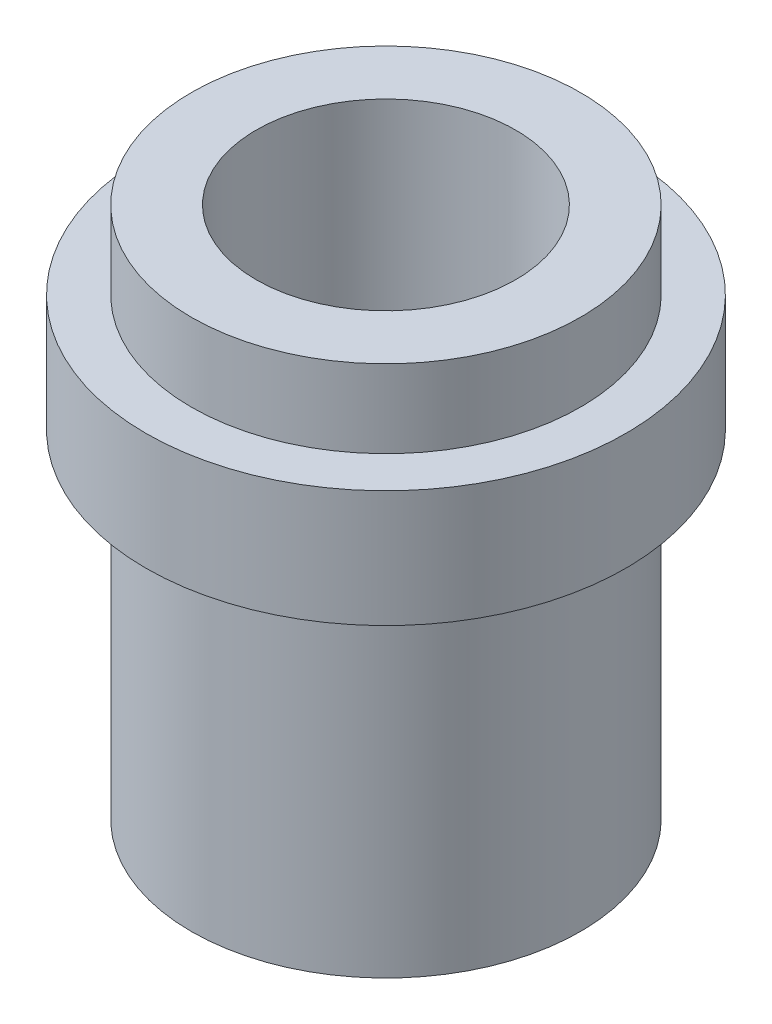
ISO-10303-21;
HEADER;
FILE_DESCRIPTION(('STEP AP214'),'2;1');
FILE_NAME('part.step','',(''),(''),'','','');
FILE_SCHEMA(('AUTOMOTIVE_DESIGN { 1 0 10303 214 1 1 1 1 }'));
ENDSEC;
DATA;
#1=APPLICATION_CONTEXT('core data for automotive mechanical design processes');
#2=APPLICATION_PROTOCOL_DEFINITION('international standard','automotive_design',2000,#1);
#3=PRODUCT_CONTEXT('',#1,'mechanical');
#4=PRODUCT('Part','Part','',(#3));
#5=PRODUCT_RELATED_PRODUCT_CATEGORY('part','',(#4));
#6=PRODUCT_DEFINITION_FORMATION('','',#4);
#7=PRODUCT_DEFINITION_CONTEXT('part definition',#1,'design');
#8=PRODUCT_DEFINITION('design','',#6,#7);
#9=PRODUCT_DEFINITION_SHAPE('','',#8);
#10=(LENGTH_UNIT() NAMED_UNIT(*) SI_UNIT(.MILLI.,.METRE.));
#11=(NAMED_UNIT(*) PLANE_ANGLE_UNIT() SI_UNIT($,.RADIAN.));
#12=(NAMED_UNIT(*) SI_UNIT($,.STERADIAN.) SOLID_ANGLE_UNIT());
#13=UNCERTAINTY_MEASURE_WITH_UNIT(LENGTH_MEASURE(1.E-05),#10,'distance_accuracy_value','');
#14=(GEOMETRIC_REPRESENTATION_CONTEXT(3) GLOBAL_UNCERTAINTY_ASSIGNED_CONTEXT((#13)) GLOBAL_UNIT_ASSIGNED_CONTEXT((#10,
#11,#12)) REPRESENTATION_CONTEXT('',''));
#15=CARTESIAN_POINT('',(0.,0.,0.));
#16=DIRECTION('',(0.,0.,1.));
#17=DIRECTION('',(1.,0.,0.));
#18=AXIS2_PLACEMENT_3D('',#15,#16,#17);
#19=CARTESIAN_POINT('',(0.,33.5814136887096,0.));
#20=DIRECTION('',(0.,-1.,0.));
#21=DIRECTION('',(0.,0.,-1.));
#22=AXIS2_PLACEMENT_3D('',#19,#20,#21);
#23=PLANE('',#22);
#24=CARTESIAN_POINT('',(0.,33.5814136887096,0.));
#25=DIRECTION('',(0.,1.,0.));
#26=DIRECTION('',(0.,0.,1.));
#27=AXIS2_PLACEMENT_3D('',#24,#25,#26);
#28=CIRCLE('',#27,10.);
#29=CARTESIAN_POINT('',(0.,33.5814136887096,10.));
#30=VERTEX_POINT('',#29);
#31=EDGE_CURVE('E56',#30,#30,#28,.T.);
#32=ORIENTED_EDGE('',*,*,#31,.F.);
#33=EDGE_LOOP('',(#32));
#34=FACE_BOUND('',#33,.T.);
#35=CARTESIAN_POINT('',(0.,33.5814136887096,0.));
#36=DIRECTION('',(0.,1.,0.));
#37=DIRECTION('',(0.,0.,1.));
#38=AXIS2_PLACEMENT_3D('',#35,#36,#37);
#39=CIRCLE('',#38,15.);
#40=CARTESIAN_POINT('',(0.,33.5814136887096,15.));
#41=VERTEX_POINT('',#40);
#42=EDGE_CURVE('E10',#41,#41,#39,.T.);
#43=ORIENTED_EDGE('',*,*,#42,.T.);
#44=EDGE_LOOP('',(#43));
#45=FACE_BOUND('',#44,.T.);
#46=ADVANCED_FACE('F31',(#34,#45),#23,.F.);
#47=CARTESIAN_POINT('',(0.,46.5033776301218,0.));
#48=DIRECTION('',(0.,1.,0.));
#49=DIRECTION('',(0.,0.,1.));
#50=AXIS2_PLACEMENT_3D('',#47,#48,#49);
#51=CYLINDRICAL_SURFACE('',#50,15.);
#52=ORIENTED_EDGE('',*,*,#42,.F.);
#53=EDGE_LOOP('',(#52));
#54=FACE_BOUND('',#53,.T.);
#55=CARTESIAN_POINT('',(0.,27.5814136887096,0.));
#56=DIRECTION('',(0.,1.,0.));
#57=DIRECTION('',(0.,0.,1.));
#58=AXIS2_PLACEMENT_3D('',#55,#56,#57);
#59=CIRCLE('',#58,15.);
#60=CARTESIAN_POINT('',(0.,27.5814136887096,15.));
#61=VERTEX_POINT('',#60);
#62=EDGE_CURVE('E38',#61,#61,#59,.T.);
#63=ORIENTED_EDGE('',*,*,#62,.T.);
#64=EDGE_LOOP('',(#63));
#65=FACE_BOUND('',#64,.T.);
#66=ADVANCED_FACE('F75',(#54,#65),#51,.T.);
#67=CARTESIAN_POINT('',(15.,27.5814136887096,0.));
#68=DIRECTION('',(0.,-1.,0.));
#69=DIRECTION('',(0.,0.,-1.));
#70=AXIS2_PLACEMENT_3D('',#67,#68,#69);
#71=PLANE('',#70);
#72=ORIENTED_EDGE('',*,*,#62,.F.);
#73=EDGE_LOOP('',(#72));
#74=FACE_BOUND('',#73,.T.);
#75=CARTESIAN_POINT('',(0.,27.5814136887096,0.));
#76=DIRECTION('',(0.,1.,0.));
#77=DIRECTION('',(0.,0.,1.));
#78=AXIS2_PLACEMENT_3D('',#75,#76,#77);
#79=CIRCLE('',#78,18.5);
#80=CARTESIAN_POINT('',(0.,27.5814136887096,18.5));
#81=VERTEX_POINT('',#80);
#82=EDGE_CURVE('E42',#81,#81,#79,.T.);
#83=ORIENTED_EDGE('',*,*,#82,.T.);
#84=EDGE_LOOP('',(#83));
#85=FACE_BOUND('',#84,.T.);
#86=ADVANCED_FACE('F80',(#74,#85),#71,.F.);
#87=CARTESIAN_POINT('',(0.,46.5033776301218,0.));
#88=DIRECTION('',(0.,1.,0.));
#89=DIRECTION('',(0.,0.,1.));
#90=AXIS2_PLACEMENT_3D('',#87,#88,#89);
#91=CYLINDRICAL_SURFACE('',#90,18.5);
#92=ORIENTED_EDGE('',*,*,#82,.F.);
#93=EDGE_LOOP('',(#92));
#94=FACE_BOUND('',#93,.T.);
#95=CARTESIAN_POINT('',(0.,18.5814136887096,0.));
#96=DIRECTION('',(0.,1.,0.));
#97=DIRECTION('',(0.,0.,1.));
#98=AXIS2_PLACEMENT_3D('',#95,#96,#97);
#99=CIRCLE('',#98,18.5);
#100=CARTESIAN_POINT('',(0.,18.5814136887096,18.5));
#101=VERTEX_POINT('',#100);
#102=EDGE_CURVE('E47',#101,#101,#99,.T.);
#103=ORIENTED_EDGE('',*,*,#102,.T.);
#104=EDGE_LOOP('',(#103));
#105=FACE_BOUND('',#104,.T.);
#106=ADVANCED_FACE('F85',(#94,#105),#91,.T.);
#107=CARTESIAN_POINT('',(18.5,18.5814136887096,0.));
#108=DIRECTION('',(0.,1.,0.));
#109=DIRECTION('',(0.,0.,1.));
#110=AXIS2_PLACEMENT_3D('',#107,#108,#109);
#111=PLANE('',#110);
#112=ORIENTED_EDGE('',*,*,#102,.F.);
#113=EDGE_LOOP('',(#112));
#114=FACE_BOUND('',#113,.T.);
#115=CARTESIAN_POINT('',(0.,18.5814136887096,0.));
#116=DIRECTION('',(0.,1.,0.));
#117=DIRECTION('',(0.,0.,1.));
#118=AXIS2_PLACEMENT_3D('',#115,#116,#117);
#119=CIRCLE('',#118,15.);
#120=CARTESIAN_POINT('',(0.,18.5814136887096,15.));
#121=VERTEX_POINT('',#120);
#122=EDGE_CURVE('E50',#121,#121,#119,.T.);
#123=ORIENTED_EDGE('',*,*,#122,.T.);
#124=EDGE_LOOP('',(#123));
#125=FACE_BOUND('',#124,.T.);
#126=ADVANCED_FACE('F92',(#114,#125),#111,.F.);
#127=CARTESIAN_POINT('',(0.,46.5033776301218,0.));
#128=DIRECTION('',(0.,1.,0.));
#129=DIRECTION('',(0.,0.,1.));
#130=AXIS2_PLACEMENT_3D('',#127,#128,#129);
#131=CYLINDRICAL_SURFACE('',#130,15.);
#132=ORIENTED_EDGE('',*,*,#122,.F.);
#133=EDGE_LOOP('',(#132));
#134=FACE_BOUND('',#133,.T.);
#135=CARTESIAN_POINT('',(0.,-7.41858631129039,0.));
#136=DIRECTION('',(0.,1.,0.));
#137=DIRECTION('',(0.,0.,1.));
#138=AXIS2_PLACEMENT_3D('',#135,#136,#137);
#139=CIRCLE('',#138,15.);
#140=CARTESIAN_POINT('',(0.,-7.41858631129039,15.));
#141=VERTEX_POINT('',#140);
#142=EDGE_CURVE('E53',#141,#141,#139,.T.);
#143=ORIENTED_EDGE('',*,*,#142,.T.);
#144=EDGE_LOOP('',(#143));
#145=FACE_BOUND('',#144,.T.);
#146=ADVANCED_FACE('F72',(#134,#145),#131,.T.);
#147=CARTESIAN_POINT('',(15.,-7.41858631129039,0.));
#148=DIRECTION('',(0.,1.,0.));
#149=DIRECTION('',(0.,0.,1.));
#150=AXIS2_PLACEMENT_3D('',#147,#148,#149);
#151=PLANE('',#150);
#152=CARTESIAN_POINT('',(0.,-7.41858631129039,0.));
#153=DIRECTION('',(0.,1.,0.));
#154=DIRECTION('',(0.,0.,1.));
#155=AXIS2_PLACEMENT_3D('',#152,#153,#154);
#156=CIRCLE('',#155,10.);
#157=CARTESIAN_POINT('',(0.,-7.41858631129039,10.));
#158=VERTEX_POINT('',#157);
#159=EDGE_CURVE('E34',#158,#158,#156,.T.);
#160=ORIENTED_EDGE('',*,*,#159,.T.);
#161=EDGE_LOOP('',(#160));
#162=FACE_BOUND('',#161,.T.);
#163=ORIENTED_EDGE('',*,*,#142,.F.);
#164=EDGE_LOOP('',(#163));
#165=FACE_BOUND('',#164,.T.);
#166=ADVANCED_FACE('F63',(#162,#165),#151,.F.);
#167=CARTESIAN_POINT('',(0.,-11.4185863112904,0.));
#168=DIRECTION('',(0.,1.,0.));
#169=DIRECTION('',(0.,0.,1.));
#170=AXIS2_PLACEMENT_3D('',#167,#168,#169);
#171=CYLINDRICAL_SURFACE('',#170,10.);
#172=ORIENTED_EDGE('',*,*,#31,.T.);
#173=EDGE_LOOP('',(#172));
#174=FACE_BOUND('',#173,.T.);
#175=ORIENTED_EDGE('',*,*,#159,.F.);
#176=EDGE_LOOP('',(#175));
#177=FACE_BOUND('',#176,.T.);
#178=ADVANCED_FACE('F66',(#174,#177),#171,.F.);
#179=CLOSED_SHELL('',(#46,#66,#86,#106,#126,#146,#166,#178));
#180=MANIFOLD_SOLID_BREP('B2',#179);
#181=ADVANCED_BREP_SHAPE_REPRESENTATION('',(#18,#180),#14);
#182=SHAPE_DEFINITION_REPRESENTATION(#9,#181);
ENDSEC;
END-ISO-10303-21;
